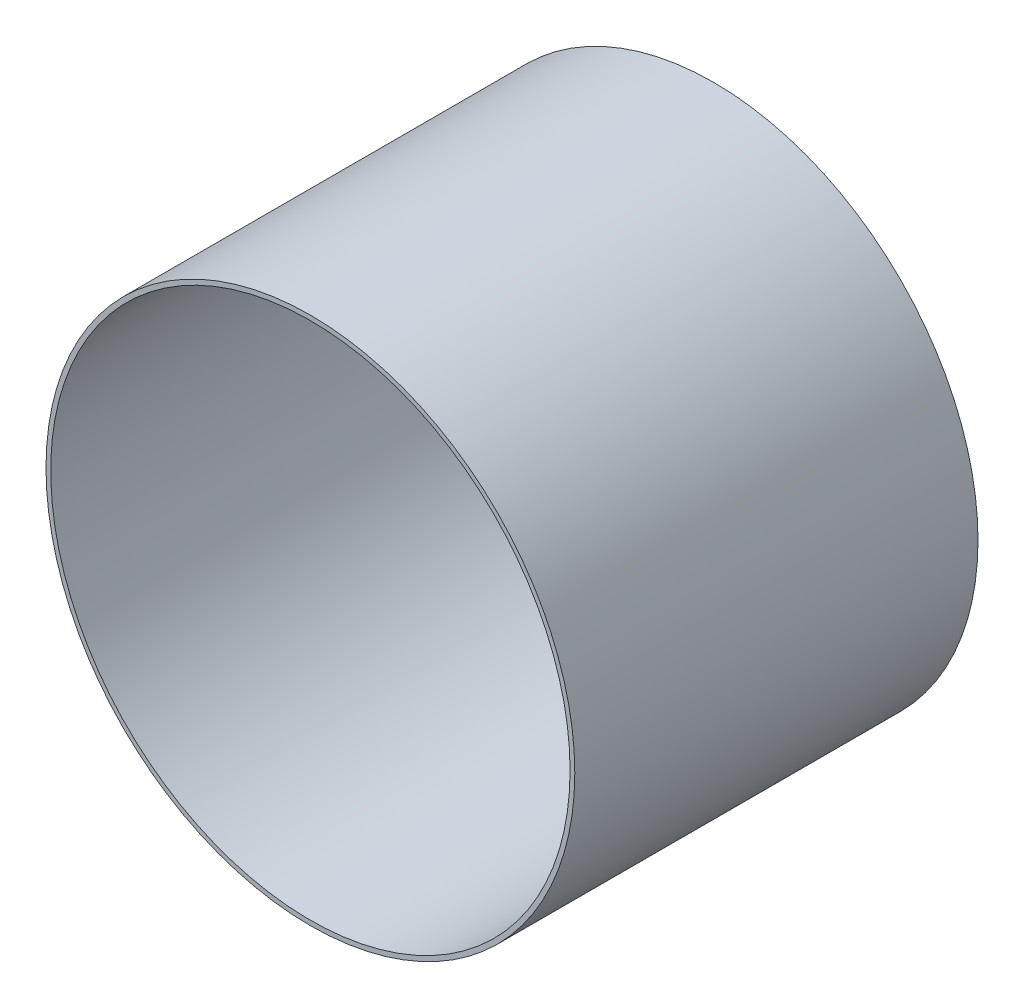
ISO-10303-21;
HEADER;
FILE_DESCRIPTION(('STEP AP214'),'2;1');
FILE_NAME('part.step','',(''),(''),'','','');
FILE_SCHEMA(('AUTOMOTIVE_DESIGN { 1 0 10303 214 1 1 1 1 }'));
ENDSEC;
DATA;
#1=APPLICATION_CONTEXT('core data for automotive mechanical design processes');
#2=APPLICATION_PROTOCOL_DEFINITION('international standard','automotive_design',2000,#1);
#3=PRODUCT_CONTEXT('',#1,'mechanical');
#4=PRODUCT('Part','Part','',(#3));
#5=PRODUCT_RELATED_PRODUCT_CATEGORY('part','',(#4));
#6=PRODUCT_DEFINITION_FORMATION('','',#4);
#7=PRODUCT_DEFINITION_CONTEXT('part definition',#1,'design');
#8=PRODUCT_DEFINITION('design','',#6,#7);
#9=PRODUCT_DEFINITION_SHAPE('','',#8);
#10=(LENGTH_UNIT() NAMED_UNIT(*) SI_UNIT(.MILLI.,.METRE.));
#11=(NAMED_UNIT(*) PLANE_ANGLE_UNIT() SI_UNIT($,.RADIAN.));
#12=(NAMED_UNIT(*) SI_UNIT($,.STERADIAN.) SOLID_ANGLE_UNIT());
#13=UNCERTAINTY_MEASURE_WITH_UNIT(LENGTH_MEASURE(1.E-05),#10,'distance_accuracy_value','');
#14=(GEOMETRIC_REPRESENTATION_CONTEXT(3) GLOBAL_UNCERTAINTY_ASSIGNED_CONTEXT((#13)) GLOBAL_UNIT_ASSIGNED_CONTEXT((#10,
#11,#12)) REPRESENTATION_CONTEXT('',''));
#15=CARTESIAN_POINT('',(0.,0.,0.));
#16=DIRECTION('',(0.,0.,1.));
#17=DIRECTION('',(1.,0.,0.));
#18=AXIS2_PLACEMENT_3D('',#15,#16,#17);
#19=CARTESIAN_POINT('',(0.,0.,108.458));
#20=DIRECTION('',(0.,0.,1.));
#21=DIRECTION('',(1.,0.,0.));
#22=AXIS2_PLACEMENT_3D('',#19,#20,#21);
#23=PLANE('',#22);
#24=CARTESIAN_POINT('',(0.,0.,108.458));
#25=DIRECTION('',(0.,0.,1.));
#26=DIRECTION('',(1.,0.,0.));
#27=AXIS2_PLACEMENT_3D('',#24,#25,#26);
#28=CIRCLE('',#27,71.12);
#29=CARTESIAN_POINT('',(71.12,0.,108.458));
#30=VERTEX_POINT('',#29);
#31=EDGE_CURVE('E10',#30,#30,#28,.T.);
#32=ORIENTED_EDGE('',*,*,#31,.T.);
#33=EDGE_LOOP('',(#32));
#34=FACE_BOUND('',#33,.T.);
#35=CARTESIAN_POINT('',(0.,0.,108.458));
#36=DIRECTION('',(0.,0.,1.));
#37=DIRECTION('',(1.,0.,0.));
#38=AXIS2_PLACEMENT_3D('',#35,#36,#37);
#39=CIRCLE('',#38,69.85);
#40=CARTESIAN_POINT('',(69.85,0.,108.458));
#41=VERTEX_POINT('',#40);
#42=EDGE_CURVE('E40',#41,#41,#39,.T.);
#43=ORIENTED_EDGE('',*,*,#42,.F.);
#44=EDGE_LOOP('',(#43));
#45=FACE_BOUND('',#44,.T.);
#46=ADVANCED_FACE('F29',(#34,#45),#23,.T.);
#47=CARTESIAN_POINT('',(0.,0.,0.));
#48=DIRECTION('',(0.,0.,1.));
#49=DIRECTION('',(1.,0.,0.));
#50=AXIS2_PLACEMENT_3D('',#47,#48,#49);
#51=PLANE('',#50);
#52=CARTESIAN_POINT('',(0.,0.,0.));
#53=DIRECTION('',(0.,0.,1.));
#54=DIRECTION('',(1.,0.,0.));
#55=AXIS2_PLACEMENT_3D('',#52,#53,#54);
#56=CIRCLE('',#55,71.12);
#57=CARTESIAN_POINT('',(71.12,0.,0.));
#58=VERTEX_POINT('',#57);
#59=EDGE_CURVE('E33',#58,#58,#56,.T.);
#60=ORIENTED_EDGE('',*,*,#59,.F.);
#61=EDGE_LOOP('',(#60));
#62=FACE_BOUND('',#61,.T.);
#63=CARTESIAN_POINT('',(0.,0.,0.));
#64=DIRECTION('',(0.,0.,1.));
#65=DIRECTION('',(1.,0.,0.));
#66=AXIS2_PLACEMENT_3D('',#63,#64,#65);
#67=CIRCLE('',#66,69.85);
#68=CARTESIAN_POINT('',(69.85,0.,0.));
#69=VERTEX_POINT('',#68);
#70=EDGE_CURVE('E42',#69,#69,#67,.T.);
#71=ORIENTED_EDGE('',*,*,#70,.T.);
#72=EDGE_LOOP('',(#71));
#73=FACE_BOUND('',#72,.T.);
#74=ADVANCED_FACE('F52',(#62,#73),#51,.F.);
#75=CARTESIAN_POINT('',(0.,0.,108.458));
#76=DIRECTION('',(0.,0.,-1.));
#77=DIRECTION('',(-1.,0.,0.));
#78=AXIS2_PLACEMENT_3D('',#75,#76,#77);
#79=CYLINDRICAL_SURFACE('',#78,71.12);
#80=ORIENTED_EDGE('',*,*,#31,.F.);
#81=EDGE_LOOP('',(#80));
#82=FACE_BOUND('',#81,.T.);
#83=ORIENTED_EDGE('',*,*,#59,.T.);
#84=EDGE_LOOP('',(#83));
#85=FACE_BOUND('',#84,.T.);
#86=ADVANCED_FACE('F31',(#82,#85),#79,.T.);
#87=CARTESIAN_POINT('',(0.,0.,108.458));
#88=DIRECTION('',(0.,0.,-1.));
#89=DIRECTION('',(-1.,0.,0.));
#90=AXIS2_PLACEMENT_3D('',#87,#88,#89);
#91=CYLINDRICAL_SURFACE('',#90,69.85);
#92=ORIENTED_EDGE('',*,*,#42,.T.);
#93=EDGE_LOOP('',(#92));
#94=FACE_BOUND('',#93,.T.);
#95=ORIENTED_EDGE('',*,*,#70,.F.);
#96=EDGE_LOOP('',(#95));
#97=FACE_BOUND('',#96,.T.);
#98=ADVANCED_FACE('F48',(#94,#97),#91,.F.);
#99=CLOSED_SHELL('',(#46,#74,#86,#98));
#100=MANIFOLD_SOLID_BREP('B2',#99);
#101=ADVANCED_BREP_SHAPE_REPRESENTATION('',(#18,#100),#14);
#102=SHAPE_DEFINITION_REPRESENTATION(#9,#101);
ENDSEC;
END-ISO-10303-21;
